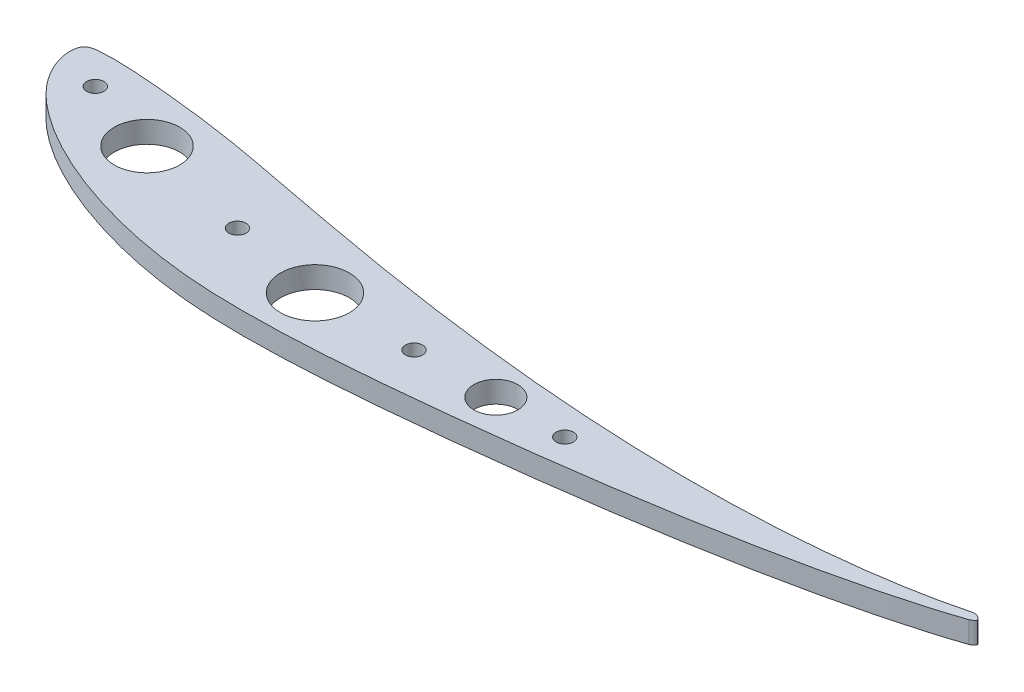
ISO-10303-21;
HEADER;
FILE_DESCRIPTION(('STEP AP214'),'2;1');
FILE_NAME('part.step','',(''),(''),'','','');
FILE_SCHEMA(('AUTOMOTIVE_DESIGN { 1 0 10303 214 1 1 1 1 }'));
ENDSEC;
DATA;
#1=APPLICATION_CONTEXT('core data for automotive mechanical design processes');
#2=APPLICATION_PROTOCOL_DEFINITION('international standard','automotive_design',2000,#1);
#3=PRODUCT_CONTEXT('',#1,'mechanical');
#4=PRODUCT('Part','Part','',(#3));
#5=PRODUCT_RELATED_PRODUCT_CATEGORY('part','',(#4));
#6=PRODUCT_DEFINITION_FORMATION('','',#4);
#7=PRODUCT_DEFINITION_CONTEXT('part definition',#1,'design');
#8=PRODUCT_DEFINITION('design','',#6,#7);
#9=PRODUCT_DEFINITION_SHAPE('','',#8);
#10=(LENGTH_UNIT() NAMED_UNIT(*) SI_UNIT(.MILLI.,.METRE.));
#11=(NAMED_UNIT(*) PLANE_ANGLE_UNIT() SI_UNIT($,.RADIAN.));
#12=(NAMED_UNIT(*) SI_UNIT($,.STERADIAN.) SOLID_ANGLE_UNIT());
#13=UNCERTAINTY_MEASURE_WITH_UNIT(LENGTH_MEASURE(1.E-05),#10,'distance_accuracy_value','');
#14=(GEOMETRIC_REPRESENTATION_CONTEXT(3) GLOBAL_UNCERTAINTY_ASSIGNED_CONTEXT((#13)) GLOBAL_UNIT_ASSIGNED_CONTEXT((#10,
#11,#12)) REPRESENTATION_CONTEXT('',''));
#15=CARTESIAN_POINT('',(0.,0.,0.));
#16=DIRECTION('',(0.,0.,1.));
#17=DIRECTION('',(1.,0.,0.));
#18=AXIS2_PLACEMENT_3D('',#15,#16,#17);
#19=CARTESIAN_POINT('',(300.,6.35,0.));
#20=CARTESIAN_POINT('',(299.998164856761,6.35,-0.00779164019471429));
#21=CARTESIAN_POINT('',(298.839344105738,6.35,0.779445448025979));
#22=CARTESIAN_POINT('',(297.554109444533,6.35,1.55726173307745));
#23=CARTESIAN_POINT('',(294.208506940897,6.35,3.56721702635008));
#24=CARTESIAN_POINT('',(289.670511836939,6.35,5.74131938651221));
#25=CARTESIAN_POINT('',(283.309862001186,6.35,8.11753774828169));
#26=CARTESIAN_POINT('',(275.537544353372,6.35,10.3445731431846));
#27=CARTESIAN_POINT('',(266.444933796636,6.35,12.426457704317));
#28=CARTESIAN_POINT('',(256.199580597518,6.35,14.2598502911637));
#29=CARTESIAN_POINT('',(244.921593272593,6.35,15.7834250973737));
#30=CARTESIAN_POINT('',(232.757799235785,6.35,16.9530358403372));
#31=CARTESIAN_POINT('',(219.853005113523,6.35,17.7238980380504));
#32=CARTESIAN_POINT('',(206.362388996271,6.35,18.0860693925888));
#33=CARTESIAN_POINT('',(192.44042495841,6.35,18.0311269506897));
#34=CARTESIAN_POINT('',(178.242435480993,6.35,17.56307599211));
#35=CARTESIAN_POINT('',(163.922450975529,6.35,16.7077342173917));
#36=CARTESIAN_POINT('',(149.630087144382,6.35,15.4990842266037));
#37=CARTESIAN_POINT('',(135.508778065951,6.35,13.9686722797518));
#38=CARTESIAN_POINT('',(121.691936539871,6.35,12.1853759659503));
#39=CARTESIAN_POINT('',(108.303825941848,6.35,10.2012162998287));
#40=CARTESIAN_POINT('',(95.459843608573,6.35,8.08910875306785));
#41=CARTESIAN_POINT('',(83.2596527272127,6.35,5.91969547385547));
#42=CARTESIAN_POINT('',(71.7928745249992,6.35,3.774518778037));
#43=CARTESIAN_POINT('',(61.1315584931208,6.35,1.74275716061366));
#44=CARTESIAN_POINT('',(51.3278305753655,6.35,-0.124120627843376));
#45=CARTESIAN_POINT('',(42.3327554987832,6.35,-1.61247291055323));
#46=CARTESIAN_POINT('',(34.1025551908546,6.35,-2.67675233764849));
#47=CARTESIAN_POINT('',(26.6411862566442,6.35,-3.50631605321759));
#48=CARTESIAN_POINT('',(19.9850247469925,6.35,-4.1190326449961));
#49=CARTESIAN_POINT('',(14.2021842694941,6.35,-4.50099392166811));
#50=CARTESIAN_POINT('',(9.35700103891614,6.35,-4.70825718215377));
#51=CARTESIAN_POINT('',(5.50429271166459,6.35,-4.57142501433732));
#52=CARTESIAN_POINT('',(2.68799181167146,6.35,-4.43064402861465));
#53=CARTESIAN_POINT('',(0.593636856288685,6.35,-3.43338336481398));
#54=CARTESIAN_POINT('',(0.0308069450739956,6.35,-1.42568576903345));
#55=CARTESIAN_POINT('',(-0.0640718384851893,6.35,0.763170367314474));
#56=CARTESIAN_POINT('',(0.432254202568729,6.35,3.35098635879112));
#57=CARTESIAN_POINT('',(1.4729571719697,6.35,6.15451507656468));
#58=CARTESIAN_POINT('',(3.09629733072932,6.35,9.10711777622798));
#59=CARTESIAN_POINT('',(5.29360442082685,6.35,12.1418862993919));
#60=CARTESIAN_POINT('',(8.15388690008128,6.35,15.165147981993));
#61=CARTESIAN_POINT('',(11.6635317936271,6.35,18.1507174716578));
#62=CARTESIAN_POINT('',(15.771669221196,6.35,21.131215206694));
#63=CARTESIAN_POINT('',(20.476582832054,6.35,24.0434365419757));
#64=CARTESIAN_POINT('',(25.7487603235278,6.35,26.847906563002));
#65=CARTESIAN_POINT('',(31.5595135868589,6.35,29.5127222634323));
#66=CARTESIAN_POINT('',(37.8901921157529,6.35,31.9837460222017));
#67=CARTESIAN_POINT('',(44.7014570616563,6.35,34.2477408683114));
#68=CARTESIAN_POINT('',(51.9643258145972,6.35,36.2517183404342));
#69=CARTESIAN_POINT('',(59.6480589671636,6.35,37.9601512245172));
#70=CARTESIAN_POINT('',(67.7447305421124,6.35,39.2781586679998));
#71=CARTESIAN_POINT('',(76.2562957950689,6.35,40.2093026225173));
#72=CARTESIAN_POINT('',(85.2173723437091,6.35,40.6671575504055));
#73=CARTESIAN_POINT('',(94.6314441770765,6.35,40.6888262072188));
#74=CARTESIAN_POINT('',(104.48101139929,6.35,40.4514160016461));
#75=CARTESIAN_POINT('',(114.71559881048,6.35,39.9059889978319));
#76=CARTESIAN_POINT('',(125.278288360106,6.35,39.1145551975775));
#77=CARTESIAN_POINT('',(136.108755033666,6.35,38.1192396920588));
#78=CARTESIAN_POINT('',(147.1308429946,6.35,36.9758806163998));
#79=CARTESIAN_POINT('',(158.254761126715,6.35,35.705837125957));
#80=CARTESIAN_POINT('',(169.388427346727,6.35,34.3410907646975));
#81=CARTESIAN_POINT('',(180.442829374971,6.35,32.872036175327));
#82=CARTESIAN_POINT('',(191.33789808679,6.35,31.3033896402533));
#83=CARTESIAN_POINT('',(202.003809913507,6.35,29.6475762150844));
#84=CARTESIAN_POINT('',(212.371583337917,6.35,27.901393520191));
#85=CARTESIAN_POINT('',(222.381472323701,6.35,26.0873016205165));
#86=CARTESIAN_POINT('',(231.970439682978,6.35,24.2079091129629));
#87=CARTESIAN_POINT('',(241.082446380239,6.35,22.2863216999922));
#88=CARTESIAN_POINT('',(249.661849638293,6.35,20.3324208391408));
#89=CARTESIAN_POINT('',(257.657514290697,6.35,18.3584097380005));
#90=CARTESIAN_POINT('',(265.023600127158,6.35,16.3785740231064));
#91=CARTESIAN_POINT('',(271.719437296641,6.35,14.4110830840994));
#92=CARTESIAN_POINT('',(277.707530364416,6.35,12.4651734676658));
#93=CARTESIAN_POINT('',(282.956795386333,6.35,10.5577331093583));
#94=CARTESIAN_POINT('',(287.442744547702,6.35,8.70223232306432));
#95=CARTESIAN_POINT('',(291.158547859847,6.35,6.92448808510608));
#96=CARTESIAN_POINT('',(294.146571525615,6.35,5.09037606158018));
#97=CARTESIAN_POINT('',(296.330771836513,6.35,3.27128977435311));
#98=CARTESIAN_POINT('',(298.182098041534,6.35,1.56138440088784));
#99=CARTESIAN_POINT('',(299.015860338567,6.35,0.742755556814873));
#100=CARTESIAN_POINT('',(300.001798578304,6.35,0.00763639301510079));
#101=CARTESIAN_POINT('',(300.,6.35,0.));
#102=B_SPLINE_CURVE_WITH_KNOTS('',3,(#19,#20,#21,#22,#23,#24,#25,#26,#27,#28,#29,#30,#31,#32,
#33,#34,#35,#36,#37,#38,#39,#40,#41,#42,#43,#44,#45,#46,#47,#48,#49,#50,#51,#52,#53,#54,#55,#56,
#57,#58,#59,#60,#61,#62,#63,#64,#65,#66,#67,#68,#69,#70,#71,#72,#73,#74,#75,#76,#77,#78,#79,#80,
#81,#82,#83,#84,#85,#86,#87,#88,#89,#90,#91,#92,#93,#94,#95,#96,#97,#98,#99,#100,#101),
.UNSPECIFIED.,.T.,.F.,(4,1,1,1,1,1,1,1,1,1,1,1,1,1,1,1,1,1,1,1,1,1,1,1,1,1,1,1,1,1,1,1,1,1,1,1,
1,1,1,1,1,1,1,1,1,1,1,1,1,1,1,1,1,1,1,1,1,1,1,1,1,1,1,1,1,1,1,1,1,1,1,1,1,1,1,1,1,1,1,1,4),(0.,
0.000999594313299323,0.00414743475003776,0.00974820897402395,0.0180443769200241,
0.0288641783652488,0.0418307896412056,0.056713806957678,0.0733412324180671,0.0915079886594421,
0.111021837040934,0.131661709492213,0.153207715119588,0.175433402170293,0.198110317315045,
0.221011446315139,0.243905882495844,0.266573311035611,0.288810349135398,0.310405035997316,
0.331177743204304,0.350943876391454,0.369556399670184,0.386864963345299,0.402753039208367,
0.417195875784384,0.430379518903367,0.44236263317429,0.453032155511854,0.462284345612073,
0.470026206002306,0.476176644820514,0.4806499474091,0.483553073373249,0.486420689318958,
0.489953231463337,0.49409692674396,0.498850588304448,0.504196750280793,0.510125492183598,
0.516691031253851,0.524011699263473,0.532092122465354,0.540897920896839,0.550403413935838,
0.560581040891741,0.571396483088815,0.582828080950065,0.594829641292505,0.607347037120814,
0.620384325080165,0.633968936607919,0.648199967415963,0.663193936825189,0.678898580785939,
0.695226562400326,0.712113220733956,0.729459406270428,0.747143116877991,0.765009771536014,
0.782904928287736,0.800688045055655,0.818242104849469,0.835449083117584,0.852211620697039,
0.868429578359411,0.884009362888173,0.898854951230209,0.912881826809319,0.926010749515415,
0.938166770937821,0.949289699209522,0.959322171916738,0.968216949447241,0.975948220006129,
0.982474409223121,0.987904722814407,0.992516501480522,0.996351137832237,0.999020322442866,1.),.UNSPECIFIED.);
#103=DIRECTION('',(0.,-1.,0.));
#104=VECTOR('',#103,1.);
#105=SURFACE_OF_LINEAR_EXTRUSION('',#102,#104);
#106=CARTESIAN_POINT('',(300.,0.,0.));
#107=CARTESIAN_POINT('',(299.998164856761,0.,-0.00779164019471429));
#108=CARTESIAN_POINT('',(298.839344105738,0.,0.779445448025979));
#109=CARTESIAN_POINT('',(297.554109444533,0.,1.55726173307745));
#110=CARTESIAN_POINT('',(294.208506940897,0.,3.56721702635008));
#111=CARTESIAN_POINT('',(289.670511836939,0.,5.74131938651221));
#112=CARTESIAN_POINT('',(283.309862001186,0.,8.11753774828169));
#113=CARTESIAN_POINT('',(275.537544353372,0.,10.3445731431846));
#114=CARTESIAN_POINT('',(266.444933796636,0.,12.426457704317));
#115=CARTESIAN_POINT('',(256.199580597518,0.,14.2598502911637));
#116=CARTESIAN_POINT('',(244.921593272593,0.,15.7834250973737));
#117=CARTESIAN_POINT('',(232.757799235785,0.,16.9530358403372));
#118=CARTESIAN_POINT('',(219.853005113523,0.,17.7238980380504));
#119=CARTESIAN_POINT('',(206.362388996271,0.,18.0860693925888));
#120=CARTESIAN_POINT('',(192.44042495841,0.,18.0311269506897));
#121=CARTESIAN_POINT('',(178.242435480993,0.,17.56307599211));
#122=CARTESIAN_POINT('',(163.922450975529,0.,16.7077342173917));
#123=CARTESIAN_POINT('',(149.630087144382,0.,15.4990842266037));
#124=CARTESIAN_POINT('',(135.508778065951,0.,13.9686722797518));
#125=CARTESIAN_POINT('',(121.691936539871,0.,12.1853759659503));
#126=CARTESIAN_POINT('',(108.303825941848,0.,10.2012162998287));
#127=CARTESIAN_POINT('',(95.459843608573,0.,8.08910875306785));
#128=CARTESIAN_POINT('',(83.2596527272127,0.,5.91969547385547));
#129=CARTESIAN_POINT('',(71.7928745249992,0.,3.774518778037));
#130=CARTESIAN_POINT('',(61.1315584931208,0.,1.74275716061366));
#131=CARTESIAN_POINT('',(51.3278305753655,0.,-0.124120627843376));
#132=CARTESIAN_POINT('',(42.3327554987832,0.,-1.61247291055323));
#133=CARTESIAN_POINT('',(34.1025551908546,0.,-2.67675233764849));
#134=CARTESIAN_POINT('',(26.6411862566442,0.,-3.50631605321759));
#135=CARTESIAN_POINT('',(19.9850247469925,0.,-4.1190326449961));
#136=CARTESIAN_POINT('',(14.2021842694941,0.,-4.50099392166811));
#137=CARTESIAN_POINT('',(9.35700103891614,0.,-4.70825718215377));
#138=CARTESIAN_POINT('',(5.50429271166459,0.,-4.57142501433732));
#139=CARTESIAN_POINT('',(2.68799181167146,0.,-4.43064402861465));
#140=CARTESIAN_POINT('',(0.593636856288685,0.,-3.43338336481398));
#141=CARTESIAN_POINT('',(0.0308069450739956,0.,-1.42568576903345));
#142=CARTESIAN_POINT('',(-0.0640718384851893,0.,0.763170367314474));
#143=CARTESIAN_POINT('',(0.432254202568729,0.,3.35098635879112));
#144=CARTESIAN_POINT('',(1.4729571719697,0.,6.15451507656468));
#145=CARTESIAN_POINT('',(3.09629733072932,0.,9.10711777622798));
#146=CARTESIAN_POINT('',(5.29360442082685,0.,12.1418862993919));
#147=CARTESIAN_POINT('',(8.15388690008128,0.,15.165147981993));
#148=CARTESIAN_POINT('',(11.6635317936271,0.,18.1507174716578));
#149=CARTESIAN_POINT('',(15.771669221196,0.,21.131215206694));
#150=CARTESIAN_POINT('',(20.476582832054,0.,24.0434365419757));
#151=CARTESIAN_POINT('',(25.7487603235278,0.,26.847906563002));
#152=CARTESIAN_POINT('',(31.5595135868589,0.,29.5127222634323));
#153=CARTESIAN_POINT('',(37.8901921157529,0.,31.9837460222017));
#154=CARTESIAN_POINT('',(44.7014570616563,0.,34.2477408683114));
#155=CARTESIAN_POINT('',(51.9643258145972,0.,36.2517183404342));
#156=CARTESIAN_POINT('',(59.6480589671636,0.,37.9601512245172));
#157=CARTESIAN_POINT('',(67.7447305421124,0.,39.2781586679998));
#158=CARTESIAN_POINT('',(76.2562957950689,0.,40.2093026225173));
#159=CARTESIAN_POINT('',(85.2173723437091,0.,40.6671575504055));
#160=CARTESIAN_POINT('',(94.6314441770765,0.,40.6888262072188));
#161=CARTESIAN_POINT('',(104.48101139929,0.,40.4514160016461));
#162=CARTESIAN_POINT('',(114.71559881048,0.,39.9059889978319));
#163=CARTESIAN_POINT('',(125.278288360106,0.,39.1145551975775));
#164=CARTESIAN_POINT('',(136.108755033666,0.,38.1192396920588));
#165=CARTESIAN_POINT('',(147.1308429946,0.,36.9758806163998));
#166=CARTESIAN_POINT('',(158.254761126715,0.,35.705837125957));
#167=CARTESIAN_POINT('',(169.388427346727,0.,34.3410907646975));
#168=CARTESIAN_POINT('',(180.442829374971,0.,32.872036175327));
#169=CARTESIAN_POINT('',(191.33789808679,0.,31.3033896402533));
#170=CARTESIAN_POINT('',(202.003809913507,0.,29.6475762150844));
#171=CARTESIAN_POINT('',(212.371583337917,0.,27.901393520191));
#172=CARTESIAN_POINT('',(222.381472323701,0.,26.0873016205165));
#173=CARTESIAN_POINT('',(231.970439682978,0.,24.2079091129629));
#174=CARTESIAN_POINT('',(241.082446380239,0.,22.2863216999922));
#175=CARTESIAN_POINT('',(249.661849638293,0.,20.3324208391408));
#176=CARTESIAN_POINT('',(257.657514290697,0.,18.3584097380005));
#177=CARTESIAN_POINT('',(265.023600127158,0.,16.3785740231064));
#178=CARTESIAN_POINT('',(271.719437296641,0.,14.4110830840994));
#179=CARTESIAN_POINT('',(277.707530364416,0.,12.4651734676658));
#180=CARTESIAN_POINT('',(282.956795386333,0.,10.5577331093583));
#181=CARTESIAN_POINT('',(287.442744547702,0.,8.70223232306432));
#182=CARTESIAN_POINT('',(291.158547859847,0.,6.92448808510608));
#183=CARTESIAN_POINT('',(294.146571525615,0.,5.09037606158018));
#184=CARTESIAN_POINT('',(296.330771836513,0.,3.27128977435311));
#185=CARTESIAN_POINT('',(298.182098041534,0.,1.56138440088784));
#186=CARTESIAN_POINT('',(299.015860338567,0.,0.742755556814873));
#187=CARTESIAN_POINT('',(300.001798578304,0.,0.00763639301510079));
#188=CARTESIAN_POINT('',(300.,0.,0.));
#189=B_SPLINE_CURVE_WITH_KNOTS('',3,(#106,#107,#108,#109,#110,#111,#112,#113,#114,#115,#116,
#117,#118,#119,#120,#121,#122,#123,#124,#125,#126,#127,#128,#129,#130,#131,#132,#133,#134,#135,
#136,#137,#138,#139,#140,#141,#142,#143,#144,#145,#146,#147,#148,#149,#150,#151,#152,#153,#154,
#155,#156,#157,#158,#159,#160,#161,#162,#163,#164,#165,#166,#167,#168,#169,#170,#171,#172,#173,
#174,#175,#176,#177,#178,#179,#180,#181,#182,#183,#184,#185,#186,#187,#188),.UNSPECIFIED.,.T.,
.F.,(4,1,1,1,1,1,1,1,1,1,1,1,1,1,1,1,1,1,1,1,1,1,1,1,1,1,1,1,1,1,1,1,1,1,1,1,1,1,1,1,1,1,1,1,1,
1,1,1,1,1,1,1,1,1,1,1,1,1,1,1,1,1,1,1,1,1,1,1,1,1,1,1,1,1,1,1,1,1,1,1,4),(0.,
0.000999594313299323,0.00414743475003776,0.00974820897402395,0.0180443769200241,
0.0288641783652488,0.0418307896412056,0.056713806957678,0.0733412324180671,0.0915079886594421,
0.111021837040934,0.131661709492213,0.153207715119588,0.175433402170293,0.198110317315045,
0.221011446315139,0.243905882495844,0.266573311035611,0.288810349135398,0.310405035997316,
0.331177743204304,0.350943876391454,0.369556399670184,0.386864963345299,0.402753039208367,
0.417195875784384,0.430379518903367,0.44236263317429,0.453032155511854,0.462284345612073,
0.470026206002306,0.476176644820514,0.4806499474091,0.483553073373249,0.486420689318958,
0.489953231463337,0.49409692674396,0.498850588304448,0.504196750280793,0.510125492183598,
0.516691031253851,0.524011699263473,0.532092122465354,0.540897920896839,0.550403413935838,
0.560581040891741,0.571396483088815,0.582828080950065,0.594829641292505,0.607347037120814,
0.620384325080165,0.633968936607919,0.648199967415963,0.663193936825189,0.678898580785939,
0.695226562400326,0.712113220733956,0.729459406270428,0.747143116877991,0.765009771536014,
0.782904928287736,0.800688045055655,0.818242104849469,0.835449083117584,0.852211620697039,
0.868429578359411,0.884009362888173,0.898854951230209,0.912881826809319,0.926010749515415,
0.938166770937821,0.949289699209522,0.959322171916738,0.968216949447241,0.975948220006129,
0.982474409223121,0.987904722814407,0.992516501480522,0.996351137832237,0.999020322442866,1.),.UNSPECIFIED.);
#190=CARTESIAN_POINT('',(276.217017502718,0.,10.0870079744667));
#191=VERTEX_POINT('',#190);
#192=CARTESIAN_POINT('',(277.685385299938,0.,12.4367443940523));
#193=VERTEX_POINT('',#192);
#194=EDGE_CURVE('E85',#191,#193,#189,.T.);
#195=ORIENTED_EDGE('',*,*,#194,.T.);
#196=DIRECTION('',(0.,-1.,0.));
#197=VECTOR('',#196,1.);
#198=CARTESIAN_POINT('',(277.685385299938,0.,12.4367443940523));
#199=LINE('',#198,#197);
#200=CARTESIAN_POINT('',(277.685385299938,6.35,12.4367443940524));
#201=VERTEX_POINT('',#200);
#202=EDGE_CURVE('E78',#193,#201,#199,.F.);
#203=ORIENTED_EDGE('',*,*,#202,.T.);
#204=CARTESIAN_POINT('',(276.217017502719,6.35,10.0870079744666));
#205=VERTEX_POINT('',#204);
#206=EDGE_CURVE('E74',#205,#201,#102,.T.);
#207=ORIENTED_EDGE('',*,*,#206,.F.);
#208=DIRECTION('',(0.,-1.,0.));
#209=VECTOR('',#208,1.);
#210=CARTESIAN_POINT('',(276.217017502719,6.35,10.0870079744667));
#211=LINE('',#210,#209);
#212=EDGE_CURVE('E83',#205,#191,#211,.T.);
#213=ORIENTED_EDGE('',*,*,#212,.T.);
#214=EDGE_LOOP('',(#195,#203,#207,#213));
#215=FACE_BOUND('',#214,.T.);
#216=ADVANCED_FACE('F39',(#215),#105,.F.);
#217=CARTESIAN_POINT('',(1.80135320374123,6.35,6.66293581408048));
#218=DIRECTION('',(0.,-1.,0.));
#219=DIRECTION('',(0.,0.,-1.));
#220=AXIS2_PLACEMENT_3D('',#217,#218,#219);
#221=PLANE('',#220);
#222=CARTESIAN_POINT('',(12.7,6.35,5.08));
#223=DIRECTION('',(0.,-1.,0.));
#224=DIRECTION('',(0.,0.,-1.));
#225=AXIS2_PLACEMENT_3D('',#222,#223,#224);
#226=CIRCLE('',#225,2.54);
#227=CARTESIAN_POINT('',(12.7,6.35,2.54));
#228=VERTEX_POINT('',#227);
#229=EDGE_CURVE('E157',#228,#228,#226,.T.);
#230=ORIENTED_EDGE('',*,*,#229,.T.);
#231=EDGE_LOOP('',(#230));
#232=FACE_BOUND('',#231,.T.);
#233=CARTESIAN_POINT('',(69.85,6.35,20.32));
#234=DIRECTION('',(0.,-1.,0.));
#235=DIRECTION('',(0.,0.,-1.));
#236=AXIS2_PLACEMENT_3D('',#233,#234,#235);
#237=CIRCLE('',#236,2.54);
#238=CARTESIAN_POINT('',(69.85,6.35,17.78));
#239=VERTEX_POINT('',#238);
#240=EDGE_CURVE('E161',#239,#239,#237,.T.);
#241=ORIENTED_EDGE('',*,*,#240,.T.);
#242=EDGE_LOOP('',(#241));
#243=FACE_BOUND('',#242,.T.);
#244=CARTESIAN_POINT('',(127.,6.35,25.4));
#245=DIRECTION('',(0.,-1.,0.));
#246=DIRECTION('',(0.,0.,-1.));
#247=AXIS2_PLACEMENT_3D('',#244,#245,#246);
#248=CIRCLE('',#247,2.53999999999998);
#249=CARTESIAN_POINT('',(127.,6.35,22.86));
#250=VERTEX_POINT('',#249);
#251=EDGE_CURVE('E210',#250,#250,#248,.T.);
#252=ORIENTED_EDGE('',*,*,#251,.T.);
#253=EDGE_LOOP('',(#252));
#254=FACE_BOUND('',#253,.T.);
#255=CARTESIAN_POINT('',(171.45,6.35,25.4));
#256=DIRECTION('',(0.,-1.,0.));
#257=DIRECTION('',(0.,0.,-1.));
#258=AXIS2_PLACEMENT_3D('',#255,#256,#257);
#259=CIRCLE('',#258,2.53999999999998);
#260=CARTESIAN_POINT('',(171.45,6.35,22.86));
#261=VERTEX_POINT('',#260);
#262=EDGE_CURVE('E213',#261,#261,#259,.T.);
#263=ORIENTED_EDGE('',*,*,#262,.T.);
#264=EDGE_LOOP('',(#263));
#265=FACE_BOUND('',#264,.T.);
#266=CARTESIAN_POINT('',(35.56,6.35,12.7));
#267=DIRECTION('',(0.,-1.,0.));
#268=DIRECTION('',(0.,0.,-1.));
#269=AXIS2_PLACEMENT_3D('',#266,#267,#268);
#270=CIRCLE('',#269,9.652);
#271=CARTESIAN_POINT('',(35.56,6.35,3.048));
#272=VERTEX_POINT('',#271);
#273=EDGE_CURVE('E94',#272,#272,#270,.T.);
#274=ORIENTED_EDGE('',*,*,#273,.T.);
#275=EDGE_LOOP('',(#274));
#276=FACE_BOUND('',#275,.T.);
#277=CARTESIAN_POINT('',(151.13,6.35,25.4));
#278=DIRECTION('',(0.,-1.,0.));
#279=DIRECTION('',(0.,0.,-1.));
#280=AXIS2_PLACEMENT_3D('',#277,#278,#279);
#281=CIRCLE('',#280,6.47700000000001);
#282=CARTESIAN_POINT('',(151.13,6.35,18.923));
#283=VERTEX_POINT('',#282);
#284=EDGE_CURVE('E167',#283,#283,#281,.T.);
#285=ORIENTED_EDGE('',*,*,#284,.T.);
#286=EDGE_LOOP('',(#285));
#287=FACE_BOUND('',#286,.T.);
#288=CARTESIAN_POINT('',(97.79,6.35,25.4));
#289=DIRECTION('',(0.,-1.,0.));
#290=DIRECTION('',(0.,0.,-1.));
#291=AXIS2_PLACEMENT_3D('',#288,#289,#290);
#292=CIRCLE('',#291,10.16);
#293=CARTESIAN_POINT('',(97.79,6.35,15.24));
#294=VERTEX_POINT('',#293);
#295=EDGE_CURVE('E165',#294,#294,#292,.T.);
#296=ORIENTED_EDGE('',*,*,#295,.T.);
#297=EDGE_LOOP('',(#296));
#298=FACE_BOUND('',#297,.T.);
#299=ORIENTED_EDGE('',*,*,#206,.T.);
#300=CARTESIAN_POINT('',(276.86,6.35,10.0345913792245));
#301=DIRECTION('',(0.,-1.,0.));
#302=DIRECTION('',(0.,0.,-1.));
#303=AXIS2_PLACEMENT_3D('',#300,#301,#302);
#304=CIRCLE('',#303,2.54);
#305=CARTESIAN_POINT('',(279.068386038965,6.35,11.2894344382973));
#306=VERTEX_POINT('',#305);
#307=EDGE_CURVE('E61',#201,#306,#304,.F.);
#308=ORIENTED_EDGE('',*,*,#307,.T.);
#309=CARTESIAN_POINT('',(276.86,6.35,12.54427749737));
#310=DIRECTION('',(0.,-1.,0.));
#311=DIRECTION('',(0.,0.,-1.));
#312=AXIS2_PLACEMENT_3D('',#309,#310,#311);
#313=CIRCLE('',#312,2.54);
#314=EDGE_CURVE('E71',#306,#205,#313,.F.);
#315=ORIENTED_EDGE('',*,*,#314,.T.);
#316=EDGE_LOOP('',(#299,#308,#315));
#317=FACE_BOUND('',#316,.T.);
#318=ADVANCED_FACE('F73',(#232,#243,#254,#265,#276,#287,#298,#317),#221,.F.);
#319=CARTESIAN_POINT('',(1.80135320374123,0.,6.66293581408048));
#320=DIRECTION('',(0.,-1.,0.));
#321=DIRECTION('',(0.,0.,-1.));
#322=AXIS2_PLACEMENT_3D('',#319,#320,#321);
#323=PLANE('',#322);
#324=CARTESIAN_POINT('',(12.7,0.,5.08));
#325=DIRECTION('',(0.,1.,0.));
#326=DIRECTION('',(0.,0.,1.));
#327=AXIS2_PLACEMENT_3D('',#324,#325,#326);
#328=CIRCLE('',#327,2.54);
#329=CARTESIAN_POINT('',(12.7,0.,7.62));
#330=VERTEX_POINT('',#329);
#331=EDGE_CURVE('E133',#330,#330,#328,.T.);
#332=ORIENTED_EDGE('',*,*,#331,.T.);
#333=EDGE_LOOP('',(#332));
#334=FACE_BOUND('',#333,.T.);
#335=CARTESIAN_POINT('',(69.85,0.,20.32));
#336=DIRECTION('',(0.,1.,0.));
#337=DIRECTION('',(0.,0.,1.));
#338=AXIS2_PLACEMENT_3D('',#335,#336,#337);
#339=CIRCLE('',#338,2.54);
#340=CARTESIAN_POINT('',(69.85,0.,22.86));
#341=VERTEX_POINT('',#340);
#342=EDGE_CURVE('E137',#341,#341,#339,.T.);
#343=ORIENTED_EDGE('',*,*,#342,.T.);
#344=EDGE_LOOP('',(#343));
#345=FACE_BOUND('',#344,.T.);
#346=CARTESIAN_POINT('',(127.,0.,25.4));
#347=DIRECTION('',(0.,1.,0.));
#348=DIRECTION('',(0.,0.,1.));
#349=AXIS2_PLACEMENT_3D('',#346,#347,#348);
#350=CIRCLE('',#349,2.53999999999998);
#351=CARTESIAN_POINT('',(127.,0.,27.94));
#352=VERTEX_POINT('',#351);
#353=EDGE_CURVE('E141',#352,#352,#350,.T.);
#354=ORIENTED_EDGE('',*,*,#353,.T.);
#355=EDGE_LOOP('',(#354));
#356=FACE_BOUND('',#355,.T.);
#357=CARTESIAN_POINT('',(171.45,0.,25.4));
#358=DIRECTION('',(0.,1.,0.));
#359=DIRECTION('',(0.,0.,1.));
#360=AXIS2_PLACEMENT_3D('',#357,#358,#359);
#361=CIRCLE('',#360,2.53999999999998);
#362=CARTESIAN_POINT('',(171.45,0.,27.94));
#363=VERTEX_POINT('',#362);
#364=EDGE_CURVE('E145',#363,#363,#361,.T.);
#365=ORIENTED_EDGE('',*,*,#364,.T.);
#366=EDGE_LOOP('',(#365));
#367=FACE_BOUND('',#366,.T.);
#368=CARTESIAN_POINT('',(35.56,0.,12.7));
#369=DIRECTION('',(0.,1.,0.));
#370=DIRECTION('',(0.,0.,1.));
#371=AXIS2_PLACEMENT_3D('',#368,#369,#370);
#372=CIRCLE('',#371,9.652);
#373=CARTESIAN_POINT('',(35.56,0.,22.352));
#374=VERTEX_POINT('',#373);
#375=EDGE_CURVE('E149',#374,#374,#372,.T.);
#376=ORIENTED_EDGE('',*,*,#375,.T.);
#377=EDGE_LOOP('',(#376));
#378=FACE_BOUND('',#377,.T.);
#379=CARTESIAN_POINT('',(151.13,0.,25.4));
#380=DIRECTION('',(0.,1.,0.));
#381=DIRECTION('',(0.,0.,1.));
#382=AXIS2_PLACEMENT_3D('',#379,#380,#381);
#383=CIRCLE('',#382,6.47700000000001);
#384=CARTESIAN_POINT('',(151.13,0.,31.877));
#385=VERTEX_POINT('',#384);
#386=EDGE_CURVE('E153',#385,#385,#383,.T.);
#387=ORIENTED_EDGE('',*,*,#386,.T.);
#388=EDGE_LOOP('',(#387));
#389=FACE_BOUND('',#388,.T.);
#390=CARTESIAN_POINT('',(97.79,0.,25.4));
#391=DIRECTION('',(0.,1.,0.));
#392=DIRECTION('',(0.,0.,1.));
#393=AXIS2_PLACEMENT_3D('',#390,#391,#392);
#394=CIRCLE('',#393,10.16);
#395=CARTESIAN_POINT('',(97.79,0.,35.56));
#396=VERTEX_POINT('',#395);
#397=EDGE_CURVE('E156',#396,#396,#394,.T.);
#398=ORIENTED_EDGE('',*,*,#397,.T.);
#399=EDGE_LOOP('',(#398));
#400=FACE_BOUND('',#399,.T.);
#401=CARTESIAN_POINT('',(276.86,0.,12.54427749737));
#402=DIRECTION('',(0.,-1.,0.));
#403=DIRECTION('',(0.,0.,-1.));
#404=AXIS2_PLACEMENT_3D('',#401,#402,#403);
#405=CIRCLE('',#404,2.54);
#406=CARTESIAN_POINT('',(279.068386038965,0.,11.2894344382973));
#407=VERTEX_POINT('',#406);
#408=EDGE_CURVE('E48',#191,#407,#405,.T.);
#409=ORIENTED_EDGE('',*,*,#408,.T.);
#410=CARTESIAN_POINT('',(276.86,0.,10.0345913792245));
#411=DIRECTION('',(0.,-1.,0.));
#412=DIRECTION('',(0.,0.,-1.));
#413=AXIS2_PLACEMENT_3D('',#410,#411,#412);
#414=CIRCLE('',#413,2.54);
#415=EDGE_CURVE('E11',#407,#193,#414,.T.);
#416=ORIENTED_EDGE('',*,*,#415,.T.);
#417=ORIENTED_EDGE('',*,*,#194,.F.);
#418=EDGE_LOOP('',(#409,#416,#417));
#419=FACE_BOUND('',#418,.T.);
#420=ADVANCED_FACE('F109',(#334,#345,#356,#367,#378,#389,#400,#419),#323,.T.);
#421=CARTESIAN_POINT('',(97.79,0.,25.4));
#422=DIRECTION('',(0.,1.,0.));
#423=DIRECTION('',(0.,0.,1.));
#424=AXIS2_PLACEMENT_3D('',#421,#422,#423);
#425=CYLINDRICAL_SURFACE('',#424,10.16);
#426=ORIENTED_EDGE('',*,*,#397,.F.);
#427=EDGE_LOOP('',(#426));
#428=FACE_BOUND('',#427,.T.);
#429=ORIENTED_EDGE('',*,*,#295,.F.);
#430=EDGE_LOOP('',(#429));
#431=FACE_BOUND('',#430,.T.);
#432=ADVANCED_FACE('F120',(#428,#431),#425,.F.);
#433=CARTESIAN_POINT('',(151.13,0.,25.4));
#434=DIRECTION('',(0.,1.,0.));
#435=DIRECTION('',(0.,0.,1.));
#436=AXIS2_PLACEMENT_3D('',#433,#434,#435);
#437=CYLINDRICAL_SURFACE('',#436,6.47700000000001);
#438=ORIENTED_EDGE('',*,*,#386,.F.);
#439=EDGE_LOOP('',(#438));
#440=FACE_BOUND('',#439,.T.);
#441=ORIENTED_EDGE('',*,*,#284,.F.);
#442=EDGE_LOOP('',(#441));
#443=FACE_BOUND('',#442,.T.);
#444=ADVANCED_FACE('F126',(#440,#443),#437,.F.);
#445=CARTESIAN_POINT('',(35.56,0.,12.7));
#446=DIRECTION('',(0.,1.,0.));
#447=DIRECTION('',(0.,0.,1.));
#448=AXIS2_PLACEMENT_3D('',#445,#446,#447);
#449=CYLINDRICAL_SURFACE('',#448,9.652);
#450=ORIENTED_EDGE('',*,*,#375,.F.);
#451=EDGE_LOOP('',(#450));
#452=FACE_BOUND('',#451,.T.);
#453=ORIENTED_EDGE('',*,*,#273,.F.);
#454=EDGE_LOOP('',(#453));
#455=FACE_BOUND('',#454,.T.);
#456=ADVANCED_FACE('F175',(#452,#455),#449,.F.);
#457=CARTESIAN_POINT('',(171.45,0.,25.4));
#458=DIRECTION('',(0.,1.,0.));
#459=DIRECTION('',(0.,0.,1.));
#460=AXIS2_PLACEMENT_3D('',#457,#458,#459);
#461=CYLINDRICAL_SURFACE('',#460,2.53999999999998);
#462=ORIENTED_EDGE('',*,*,#364,.F.);
#463=EDGE_LOOP('',(#462));
#464=FACE_BOUND('',#463,.T.);
#465=ORIENTED_EDGE('',*,*,#262,.F.);
#466=EDGE_LOOP('',(#465));
#467=FACE_BOUND('',#466,.T.);
#468=ADVANCED_FACE('F177',(#464,#467),#461,.F.);
#469=CARTESIAN_POINT('',(127.,0.,25.4));
#470=DIRECTION('',(0.,1.,0.));
#471=DIRECTION('',(0.,0.,1.));
#472=AXIS2_PLACEMENT_3D('',#469,#470,#471);
#473=CYLINDRICAL_SURFACE('',#472,2.53999999999998);
#474=ORIENTED_EDGE('',*,*,#353,.F.);
#475=EDGE_LOOP('',(#474));
#476=FACE_BOUND('',#475,.T.);
#477=ORIENTED_EDGE('',*,*,#251,.F.);
#478=EDGE_LOOP('',(#477));
#479=FACE_BOUND('',#478,.T.);
#480=ADVANCED_FACE('F184',(#476,#479),#473,.F.);
#481=CARTESIAN_POINT('',(69.85,0.,20.32));
#482=DIRECTION('',(0.,1.,0.));
#483=DIRECTION('',(0.,0.,1.));
#484=AXIS2_PLACEMENT_3D('',#481,#482,#483);
#485=CYLINDRICAL_SURFACE('',#484,2.54);
#486=ORIENTED_EDGE('',*,*,#342,.F.);
#487=EDGE_LOOP('',(#486));
#488=FACE_BOUND('',#487,.T.);
#489=ORIENTED_EDGE('',*,*,#240,.F.);
#490=EDGE_LOOP('',(#489));
#491=FACE_BOUND('',#490,.T.);
#492=ADVANCED_FACE('F192',(#488,#491),#485,.F.);
#493=CARTESIAN_POINT('',(12.7,0.,5.08));
#494=DIRECTION('',(0.,1.,0.));
#495=DIRECTION('',(0.,0.,1.));
#496=AXIS2_PLACEMENT_3D('',#493,#494,#495);
#497=CYLINDRICAL_SURFACE('',#496,2.54);
#498=ORIENTED_EDGE('',*,*,#331,.F.);
#499=EDGE_LOOP('',(#498));
#500=FACE_BOUND('',#499,.T.);
#501=ORIENTED_EDGE('',*,*,#229,.F.);
#502=EDGE_LOOP('',(#501));
#503=FACE_BOUND('',#502,.T.);
#504=ADVANCED_FACE('F117',(#500,#503),#497,.F.);
#505=CARTESIAN_POINT('',(276.86,3.175,12.54427749737));
#506=DIRECTION('',(0.,-1.,0.));
#507=DIRECTION('',(0.,0.,-1.));
#508=AXIS2_PLACEMENT_3D('',#505,#506,#507);
#509=CYLINDRICAL_SURFACE('',#508,2.54);
#510=DIRECTION('',(0.,-1.,0.));
#511=VECTOR('',#510,1.);
#512=CARTESIAN_POINT('',(279.068386038965,3.175,11.2894344382973));
#513=LINE('',#512,#511);
#514=EDGE_CURVE('E43',#407,#306,#513,.F.);
#515=ORIENTED_EDGE('',*,*,#514,.F.);
#516=ORIENTED_EDGE('',*,*,#408,.F.);
#517=ORIENTED_EDGE('',*,*,#212,.F.);
#518=ORIENTED_EDGE('',*,*,#314,.F.);
#519=EDGE_LOOP('',(#515,#516,#517,#518));
#520=FACE_BOUND('',#519,.T.);
#521=ADVANCED_FACE('F41',(#520),#509,.T.);
#522=CARTESIAN_POINT('',(276.86,3.175,10.0345913792245));
#523=DIRECTION('',(0.,-1.,0.));
#524=DIRECTION('',(0.,0.,-1.));
#525=AXIS2_PLACEMENT_3D('',#522,#523,#524);
#526=CYLINDRICAL_SURFACE('',#525,2.54);
#527=ORIENTED_EDGE('',*,*,#415,.F.);
#528=ORIENTED_EDGE('',*,*,#514,.T.);
#529=ORIENTED_EDGE('',*,*,#307,.F.);
#530=ORIENTED_EDGE('',*,*,#202,.F.);
#531=EDGE_LOOP('',(#527,#528,#529,#530));
#532=FACE_BOUND('',#531,.T.);
#533=ADVANCED_FACE('F111',(#532),#526,.T.);
#534=CLOSED_SHELL('',(#216,#318,#420,#432,#444,#456,#468,#480,#492,#504,#521,#533));
#535=MANIFOLD_SOLID_BREP('B2',#534);
#536=ADVANCED_BREP_SHAPE_REPRESENTATION('',(#18,#535),#14);
#537=SHAPE_DEFINITION_REPRESENTATION(#9,#536);
ENDSEC;
END-ISO-10303-21;
